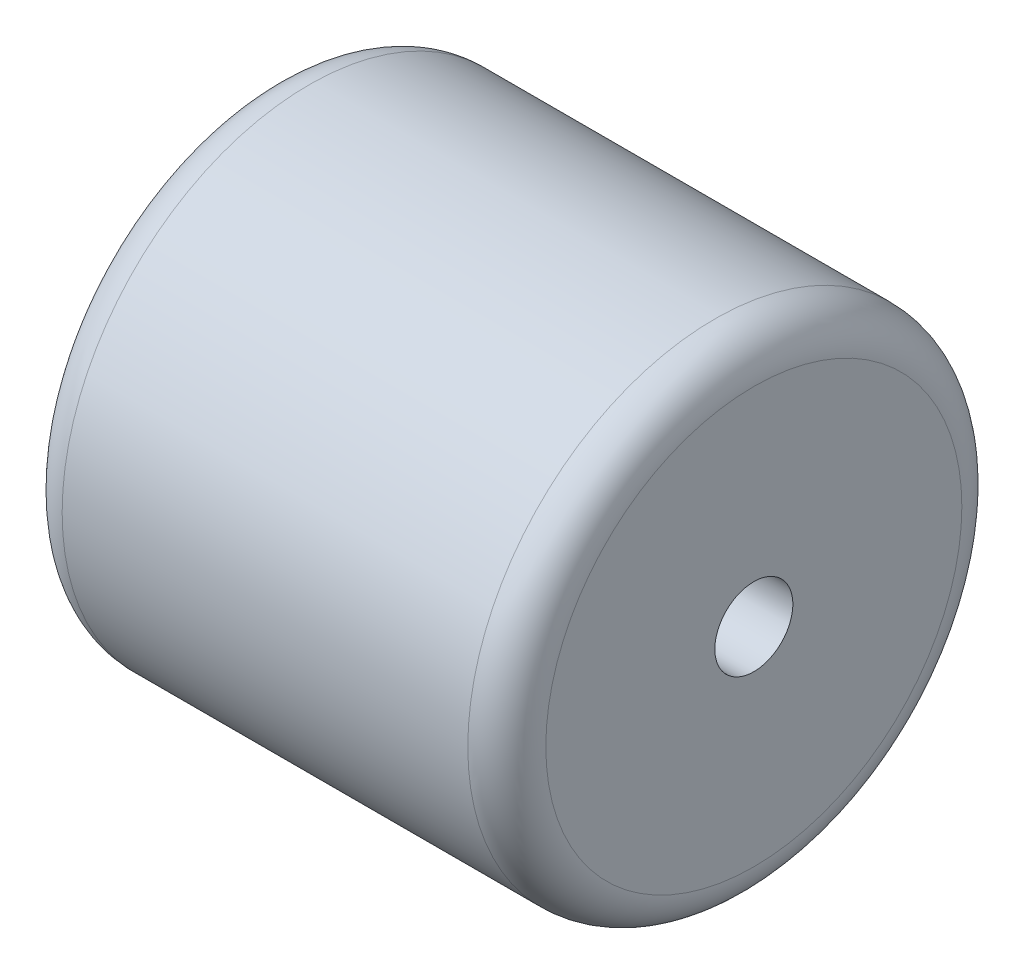
ISO-10303-21;
HEADER;
FILE_DESCRIPTION(('STEP AP214'),'2;1');
FILE_NAME('part.step','',(''),(''),'','','');
FILE_SCHEMA(('AUTOMOTIVE_DESIGN { 1 0 10303 214 1 1 1 1 }'));
ENDSEC;
DATA;
#1=APPLICATION_CONTEXT('core data for automotive mechanical design processes');
#2=APPLICATION_PROTOCOL_DEFINITION('international standard','automotive_design',2000,#1);
#3=PRODUCT_CONTEXT('',#1,'mechanical');
#4=PRODUCT('Part','Part','',(#3));
#5=PRODUCT_RELATED_PRODUCT_CATEGORY('part','',(#4));
#6=PRODUCT_DEFINITION_FORMATION('','',#4);
#7=PRODUCT_DEFINITION_CONTEXT('part definition',#1,'design');
#8=PRODUCT_DEFINITION('design','',#6,#7);
#9=PRODUCT_DEFINITION_SHAPE('','',#8);
#10=(LENGTH_UNIT() NAMED_UNIT(*) SI_UNIT(.MILLI.,.METRE.));
#11=(NAMED_UNIT(*) PLANE_ANGLE_UNIT() SI_UNIT($,.RADIAN.));
#12=(NAMED_UNIT(*) SI_UNIT($,.STERADIAN.) SOLID_ANGLE_UNIT());
#13=UNCERTAINTY_MEASURE_WITH_UNIT(LENGTH_MEASURE(1.E-05),#10,'distance_accuracy_value','');
#14=(GEOMETRIC_REPRESENTATION_CONTEXT(3) GLOBAL_UNCERTAINTY_ASSIGNED_CONTEXT((#13)) GLOBAL_UNIT_ASSIGNED_CONTEXT((#10,
#11,#12)) REPRESENTATION_CONTEXT('',''));
#15=CARTESIAN_POINT('',(0.,0.,0.));
#16=DIRECTION('',(0.,0.,1.));
#17=DIRECTION('',(1.,0.,0.));
#18=AXIS2_PLACEMENT_3D('',#15,#16,#17);
#19=CARTESIAN_POINT('',(-9.3,1.5,0.));
#20=DIRECTION('',(1.,0.,0.));
#21=DIRECTION('',(0.,0.,-1.));
#22=AXIS2_PLACEMENT_3D('',#19,#20,#21);
#23=PLANE('',#22);
#24=CARTESIAN_POINT('',(-9.3,0.,0.));
#25=DIRECTION('',(-1.,0.,0.));
#26=DIRECTION('',(0.,0.,1.));
#27=AXIS2_PLACEMENT_3D('',#24,#25,#26);
#28=CIRCLE('',#27,1.5);
#29=CARTESIAN_POINT('',(-9.3,0.,1.5));
#30=VERTEX_POINT('',#29);
#31=EDGE_CURVE('E56',#30,#30,#28,.T.);
#32=ORIENTED_EDGE('',*,*,#31,.F.);
#33=EDGE_LOOP('',(#32));
#34=FACE_BOUND('',#33,.T.);
#35=CARTESIAN_POINT('',(-9.3,0.,0.));
#36=DIRECTION('',(-1.,0.,0.));
#37=DIRECTION('',(0.,0.,1.));
#38=AXIS2_PLACEMENT_3D('',#35,#36,#37);
#39=CIRCLE('',#38,8.);
#40=CARTESIAN_POINT('',(-9.3,0.,8.));
#41=VERTEX_POINT('',#40);
#42=EDGE_CURVE('E10',#41,#41,#39,.T.);
#43=ORIENTED_EDGE('',*,*,#42,.T.);
#44=EDGE_LOOP('',(#43));
#45=FACE_BOUND('',#44,.T.);
#46=ADVANCED_FACE('F34',(#34,#45),#23,.F.);
#47=CARTESIAN_POINT('',(-7.8,0.,0.));
#48=DIRECTION('',(-1.,0.,0.));
#49=DIRECTION('',(0.,0.,1.));
#50=AXIS2_PLACEMENT_3D('',#47,#48,#49);
#51=TOROIDAL_SURFACE('',#50,8.,1.5);
#52=ORIENTED_EDGE('',*,*,#42,.F.);
#53=EDGE_LOOP('',(#52));
#54=FACE_BOUND('',#53,.T.);
#55=CARTESIAN_POINT('',(-7.8,0.,0.));
#56=DIRECTION('',(-1.,0.,0.));
#57=DIRECTION('',(0.,0.,1.));
#58=AXIS2_PLACEMENT_3D('',#55,#56,#57);
#59=CIRCLE('',#58,9.5);
#60=CARTESIAN_POINT('',(-7.8,0.,9.5));
#61=VERTEX_POINT('',#60);
#62=EDGE_CURVE('E40',#61,#61,#59,.T.);
#63=ORIENTED_EDGE('',*,*,#62,.T.);
#64=EDGE_LOOP('',(#63));
#65=FACE_BOUND('',#64,.T.);
#66=ADVANCED_FACE('F63',(#54,#65),#51,.T.);
#67=CARTESIAN_POINT('',(-3.87280275311928,0.,0.));
#68=DIRECTION('',(-1.,0.,0.));
#69=DIRECTION('',(0.,0.,1.));
#70=AXIS2_PLACEMENT_3D('',#67,#68,#69);
#71=CYLINDRICAL_SURFACE('',#70,9.5);
#72=ORIENTED_EDGE('',*,*,#62,.F.);
#73=EDGE_LOOP('',(#72));
#74=FACE_BOUND('',#73,.T.);
#75=CARTESIAN_POINT('',(7.8,0.,0.));
#76=DIRECTION('',(-1.,0.,0.));
#77=DIRECTION('',(0.,0.,1.));
#78=AXIS2_PLACEMENT_3D('',#75,#76,#77);
#79=CIRCLE('',#78,9.5);
#80=CARTESIAN_POINT('',(7.8,0.,9.5));
#81=VERTEX_POINT('',#80);
#82=EDGE_CURVE('E44',#81,#81,#79,.T.);
#83=ORIENTED_EDGE('',*,*,#82,.T.);
#84=EDGE_LOOP('',(#83));
#85=FACE_BOUND('',#84,.T.);
#86=ADVANCED_FACE('F67',(#74,#85),#71,.T.);
#87=CARTESIAN_POINT('',(7.8,0.,0.));
#88=DIRECTION('',(-1.,0.,0.));
#89=DIRECTION('',(0.,0.,1.));
#90=AXIS2_PLACEMENT_3D('',#87,#88,#89);
#91=TOROIDAL_SURFACE('',#90,8.,1.5);
#92=ORIENTED_EDGE('',*,*,#82,.F.);
#93=EDGE_LOOP('',(#92));
#94=FACE_BOUND('',#93,.T.);
#95=CARTESIAN_POINT('',(9.3,0.,0.));
#96=DIRECTION('',(-1.,0.,0.));
#97=DIRECTION('',(0.,0.,1.));
#98=AXIS2_PLACEMENT_3D('',#95,#96,#97);
#99=CIRCLE('',#98,8.);
#100=CARTESIAN_POINT('',(9.3,0.,8.));
#101=VERTEX_POINT('',#100);
#102=EDGE_CURVE('E48',#101,#101,#99,.T.);
#103=ORIENTED_EDGE('',*,*,#102,.T.);
#104=EDGE_LOOP('',(#103));
#105=FACE_BOUND('',#104,.T.);
#106=ADVANCED_FACE('F72',(#94,#105),#91,.T.);
#107=CARTESIAN_POINT('',(9.3,1.5,0.));
#108=DIRECTION('',(-1.,0.,0.));
#109=DIRECTION('',(0.,0.,1.));
#110=AXIS2_PLACEMENT_3D('',#107,#108,#109);
#111=PLANE('',#110);
#112=ORIENTED_EDGE('',*,*,#102,.F.);
#113=EDGE_LOOP('',(#112));
#114=FACE_BOUND('',#113,.T.);
#115=CARTESIAN_POINT('',(9.3,0.,0.));
#116=DIRECTION('',(-1.,0.,0.));
#117=DIRECTION('',(0.,0.,1.));
#118=AXIS2_PLACEMENT_3D('',#115,#116,#117);
#119=CIRCLE('',#118,1.5);
#120=CARTESIAN_POINT('',(9.3,0.,1.5));
#121=VERTEX_POINT('',#120);
#122=EDGE_CURVE('E53',#121,#121,#119,.T.);
#123=ORIENTED_EDGE('',*,*,#122,.T.);
#124=EDGE_LOOP('',(#123));
#125=FACE_BOUND('',#124,.T.);
#126=ADVANCED_FACE('F78',(#114,#125),#111,.F.);
#127=CARTESIAN_POINT('',(-3.87280275311928,0.,0.));
#128=DIRECTION('',(-1.,0.,0.));
#129=DIRECTION('',(0.,0.,1.));
#130=AXIS2_PLACEMENT_3D('',#127,#128,#129);
#131=CYLINDRICAL_SURFACE('',#130,1.5);
#132=ORIENTED_EDGE('',*,*,#122,.F.);
#133=EDGE_LOOP('',(#132));
#134=FACE_BOUND('',#133,.T.);
#135=ORIENTED_EDGE('',*,*,#31,.T.);
#136=EDGE_LOOP('',(#135));
#137=FACE_BOUND('',#136,.T.);
#138=ADVANCED_FACE('F60',(#134,#137),#131,.F.);
#139=CLOSED_SHELL('',(#46,#66,#86,#106,#126,#138));
#140=MANIFOLD_SOLID_BREP('B2',#139);
#141=ADVANCED_BREP_SHAPE_REPRESENTATION('',(#18,#140),#14);
#142=SHAPE_DEFINITION_REPRESENTATION(#9,#141);
ENDSEC;
END-ISO-10303-21;
